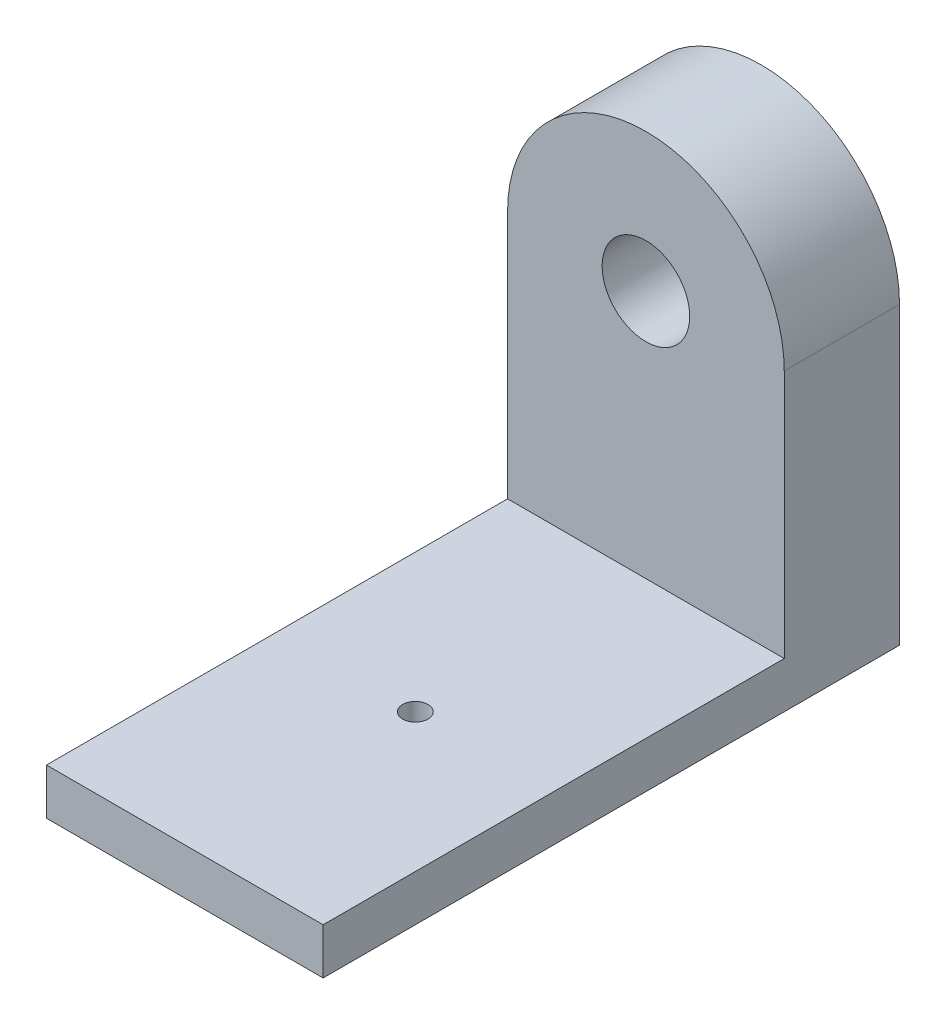
ISO-10303-21;
HEADER;
FILE_DESCRIPTION(('STEP AP214'),'2;1');
FILE_NAME('part.step','',(''),(''),'','','');
FILE_SCHEMA(('AUTOMOTIVE_DESIGN { 1 0 10303 214 1 1 1 1 }'));
ENDSEC;
DATA;
#1=APPLICATION_CONTEXT('core data for automotive mechanical design processes');
#2=APPLICATION_PROTOCOL_DEFINITION('international standard','automotive_design',2000,#1);
#3=PRODUCT_CONTEXT('',#1,'mechanical');
#4=PRODUCT('Part','Part','',(#3));
#5=PRODUCT_RELATED_PRODUCT_CATEGORY('part','',(#4));
#6=PRODUCT_DEFINITION_FORMATION('','',#4);
#7=PRODUCT_DEFINITION_CONTEXT('part definition',#1,'design');
#8=PRODUCT_DEFINITION('design','',#6,#7);
#9=PRODUCT_DEFINITION_SHAPE('','',#8);
#10=(LENGTH_UNIT() NAMED_UNIT(*) SI_UNIT(.MILLI.,.METRE.));
#11=(NAMED_UNIT(*) PLANE_ANGLE_UNIT() SI_UNIT($,.RADIAN.));
#12=(NAMED_UNIT(*) SI_UNIT($,.STERADIAN.) SOLID_ANGLE_UNIT());
#13=UNCERTAINTY_MEASURE_WITH_UNIT(LENGTH_MEASURE(1.E-05),#10,'distance_accuracy_value','');
#14=(GEOMETRIC_REPRESENTATION_CONTEXT(3) GLOBAL_UNCERTAINTY_ASSIGNED_CONTEXT((#13)) GLOBAL_UNIT_ASSIGNED_CONTEXT((#10,
#11,#12)) REPRESENTATION_CONTEXT('',''));
#15=CARTESIAN_POINT('',(0.,0.,0.));
#16=DIRECTION('',(0.,0.,1.));
#17=DIRECTION('',(1.,0.,0.));
#18=AXIS2_PLACEMENT_3D('',#15,#16,#17);
#19=CARTESIAN_POINT('',(0.,10.,0.));
#20=DIRECTION('',(1.,0.,0.));
#21=DIRECTION('',(0.,0.,-1.));
#22=AXIS2_PLACEMENT_3D('',#19,#20,#21);
#23=PLANE('',#22);
#24=DIRECTION('',(0.,0.,1.));
#25=VECTOR('',#24,1.);
#26=CARTESIAN_POINT('',(0.,0.,0.));
#27=LINE('',#26,#25);
#28=CARTESIAN_POINT('',(0.,0.,-125.));
#29=VERTEX_POINT('',#28);
#30=CARTESIAN_POINT('',(0.,0.,0.));
#31=VERTEX_POINT('',#30);
#32=EDGE_CURVE('E99',#29,#31,#27,.T.);
#33=ORIENTED_EDGE('',*,*,#32,.T.);
#34=DIRECTION('',(0.,-1.,0.));
#35=VECTOR('',#34,1.);
#36=CARTESIAN_POINT('',(0.,10.,0.));
#37=LINE('',#36,#35);
#38=CARTESIAN_POINT('',(0.,10.,0.));
#39=VERTEX_POINT('',#38);
#40=EDGE_CURVE('E11',#39,#31,#37,.T.);
#41=ORIENTED_EDGE('',*,*,#40,.F.);
#42=DIRECTION('',(0.,0.,1.));
#43=VECTOR('',#42,1.);
#44=CARTESIAN_POINT('',(0.,10.,0.));
#45=LINE('',#44,#43);
#46=CARTESIAN_POINT('',(0.,10.,-100.));
#47=VERTEX_POINT('',#46);
#48=EDGE_CURVE('E93',#47,#39,#45,.T.);
#49=ORIENTED_EDGE('',*,*,#48,.F.);
#50=DIRECTION('',(0.,1.,0.));
#51=VECTOR('',#50,1.);
#52=CARTESIAN_POINT('',(0.,10.,-100.));
#53=LINE('',#52,#51);
#54=CARTESIAN_POINT('',(0.,64.,-100.));
#55=VERTEX_POINT('',#54);
#56=EDGE_CURVE('E51',#47,#55,#53,.T.);
#57=ORIENTED_EDGE('',*,*,#56,.T.);
#58=DIRECTION('',(0.,0.,-1.));
#59=VECTOR('',#58,1.);
#60=CARTESIAN_POINT('',(0.,64.,-100.));
#61=LINE('',#60,#59);
#62=CARTESIAN_POINT('',(0.,64.,-125.));
#63=VERTEX_POINT('',#62);
#64=EDGE_CURVE('E101',#55,#63,#61,.T.);
#65=ORIENTED_EDGE('',*,*,#64,.T.);
#66=DIRECTION('',(0.,-1.,0.));
#67=VECTOR('',#66,1.);
#68=CARTESIAN_POINT('',(0.,10.,-125.));
#69=LINE('',#68,#67);
#70=EDGE_CURVE('E86',#63,#29,#69,.T.);
#71=ORIENTED_EDGE('',*,*,#70,.T.);
#72=EDGE_LOOP('',(#33,#41,#49,#57,#65,#71));
#73=FACE_BOUND('',#72,.T.);
#74=ADVANCED_FACE('F35',(#73),#23,.F.);
#75=CARTESIAN_POINT('',(0.,10.,0.));
#76=DIRECTION('',(0.,0.,-1.));
#77=DIRECTION('',(-1.,0.,0.));
#78=AXIS2_PLACEMENT_3D('',#75,#76,#77);
#79=PLANE('',#78);
#80=DIRECTION('',(1.,0.,0.));
#81=VECTOR('',#80,1.);
#82=CARTESIAN_POINT('',(0.,0.,0.));
#83=LINE('',#82,#81);
#84=CARTESIAN_POINT('',(60.,0.,0.));
#85=VERTEX_POINT('',#84);
#86=EDGE_CURVE('E106',#31,#85,#83,.T.);
#87=ORIENTED_EDGE('',*,*,#86,.T.);
#88=DIRECTION('',(0.,-1.,0.));
#89=VECTOR('',#88,1.);
#90=CARTESIAN_POINT('',(60.,10.,0.));
#91=LINE('',#90,#89);
#92=CARTESIAN_POINT('',(60.,10.,0.));
#93=VERTEX_POINT('',#92);
#94=EDGE_CURVE('E43',#93,#85,#91,.T.);
#95=ORIENTED_EDGE('',*,*,#94,.F.);
#96=DIRECTION('',(1.,0.,0.));
#97=VECTOR('',#96,1.);
#98=CARTESIAN_POINT('',(0.,10.,0.));
#99=LINE('',#98,#97);
#100=EDGE_CURVE('E60',#39,#93,#99,.T.);
#101=ORIENTED_EDGE('',*,*,#100,.F.);
#102=ORIENTED_EDGE('',*,*,#40,.T.);
#103=EDGE_LOOP('',(#87,#95,#101,#102));
#104=FACE_BOUND('',#103,.T.);
#105=ADVANCED_FACE('F173',(#104),#79,.F.);
#106=CARTESIAN_POINT('',(60.,10.,0.));
#107=DIRECTION('',(-1.,0.,0.));
#108=DIRECTION('',(0.,0.,1.));
#109=AXIS2_PLACEMENT_3D('',#106,#107,#108);
#110=PLANE('',#109);
#111=DIRECTION('',(0.,0.,-1.));
#112=VECTOR('',#111,1.);
#113=CARTESIAN_POINT('',(60.,0.,0.));
#114=LINE('',#113,#112);
#115=CARTESIAN_POINT('',(60.,0.,-125.));
#116=VERTEX_POINT('',#115);
#117=EDGE_CURVE('E94',#85,#116,#114,.T.);
#118=ORIENTED_EDGE('',*,*,#117,.T.);
#119=DIRECTION('',(0.,-1.,0.));
#120=VECTOR('',#119,1.);
#121=CARTESIAN_POINT('',(60.,10.,-125.));
#122=LINE('',#121,#120);
#123=CARTESIAN_POINT('',(60.,64.,-125.));
#124=VERTEX_POINT('',#123);
#125=EDGE_CURVE('E89',#124,#116,#122,.T.);
#126=ORIENTED_EDGE('',*,*,#125,.F.);
#127=DIRECTION('',(0.,0.,-1.));
#128=VECTOR('',#127,1.);
#129=CARTESIAN_POINT('',(60.,64.,-100.));
#130=LINE('',#129,#128);
#131=CARTESIAN_POINT('',(60.,64.,-100.));
#132=VERTEX_POINT('',#131);
#133=EDGE_CURVE('E107',#132,#124,#130,.T.);
#134=ORIENTED_EDGE('',*,*,#133,.F.);
#135=DIRECTION('',(0.,-1.,0.));
#136=VECTOR('',#135,1.);
#137=CARTESIAN_POINT('',(60.,10.,-100.));
#138=LINE('',#137,#136);
#139=CARTESIAN_POINT('',(60.,10.,-100.));
#140=VERTEX_POINT('',#139);
#141=EDGE_CURVE('E138',#132,#140,#138,.T.);
#142=ORIENTED_EDGE('',*,*,#141,.T.);
#143=DIRECTION('',(0.,0.,-1.));
#144=VECTOR('',#143,1.);
#145=CARTESIAN_POINT('',(60.,10.,0.));
#146=LINE('',#145,#144);
#147=EDGE_CURVE('E103',#93,#140,#146,.T.);
#148=ORIENTED_EDGE('',*,*,#147,.F.);
#149=ORIENTED_EDGE('',*,*,#94,.T.);
#150=EDGE_LOOP('',(#118,#126,#134,#142,#148,#149));
#151=FACE_BOUND('',#150,.T.);
#152=ADVANCED_FACE('F135',(#151),#110,.F.);
#153=CARTESIAN_POINT('',(0.,10.,-125.));
#154=DIRECTION('',(0.,0.,1.));
#155=DIRECTION('',(1.,0.,0.));
#156=AXIS2_PLACEMENT_3D('',#153,#154,#155);
#157=PLANE('',#156);
#158=DIRECTION('',(-1.,0.,0.));
#159=VECTOR('',#158,1.);
#160=CARTESIAN_POINT('',(0.,0.,-125.));
#161=LINE('',#160,#159);
#162=EDGE_CURVE('E80',#116,#29,#161,.T.);
#163=ORIENTED_EDGE('',*,*,#162,.T.);
#164=ORIENTED_EDGE('',*,*,#70,.F.);
#165=CARTESIAN_POINT('',(30.,64.,-125.));
#166=DIRECTION('',(0.,0.,-1.));
#167=DIRECTION('',(-1.,0.,0.));
#168=AXIS2_PLACEMENT_3D('',#165,#166,#167);
#169=CIRCLE('',#168,30.);
#170=EDGE_CURVE('E140',#63,#124,#169,.T.);
#171=ORIENTED_EDGE('',*,*,#170,.T.);
#172=ORIENTED_EDGE('',*,*,#125,.T.);
#173=EDGE_LOOP('',(#163,#164,#171,#172));
#174=FACE_BOUND('',#173,.T.);
#175=CARTESIAN_POINT('',(30.,64.,-125.));
#176=DIRECTION('',(0.,0.,-1.));
#177=DIRECTION('',(-1.,0.,0.));
#178=AXIS2_PLACEMENT_3D('',#175,#176,#177);
#179=CIRCLE('',#178,9.5);
#180=CARTESIAN_POINT('',(20.5,64.,-125.));
#181=VERTEX_POINT('',#180);
#182=EDGE_CURVE('E151',#181,#181,#179,.T.);
#183=ORIENTED_EDGE('',*,*,#182,.F.);
#184=EDGE_LOOP('',(#183));
#185=FACE_BOUND('',#184,.T.);
#186=ADVANCED_FACE('F82',(#174,#185),#157,.F.);
#187=CARTESIAN_POINT('',(0.,10.,-125.));
#188=DIRECTION('',(0.,-1.,0.));
#189=DIRECTION('',(0.,0.,-1.));
#190=AXIS2_PLACEMENT_3D('',#187,#188,#189);
#191=PLANE('',#190);
#192=CARTESIAN_POINT('',(30.,10.,-50.));
#193=DIRECTION('',(0.,1.,0.));
#194=DIRECTION('',(0.,0.,1.));
#195=AXIS2_PLACEMENT_3D('',#192,#193,#194);
#196=CIRCLE('',#195,2.75);
#197=CARTESIAN_POINT('',(30.,10.,-47.25));
#198=VERTEX_POINT('',#197);
#199=EDGE_CURVE('E194',#198,#198,#196,.T.);
#200=ORIENTED_EDGE('',*,*,#199,.F.);
#201=EDGE_LOOP('',(#200));
#202=FACE_BOUND('',#201,.T.);
#203=ORIENTED_EDGE('',*,*,#147,.T.);
#204=DIRECTION('',(-1.,0.,0.));
#205=VECTOR('',#204,1.);
#206=CARTESIAN_POINT('',(60.,10.,-100.));
#207=LINE('',#206,#205);
#208=EDGE_CURVE('E128',#140,#47,#207,.T.);
#209=ORIENTED_EDGE('',*,*,#208,.T.);
#210=ORIENTED_EDGE('',*,*,#48,.T.);
#211=ORIENTED_EDGE('',*,*,#100,.T.);
#212=EDGE_LOOP('',(#203,#209,#210,#211));
#213=FACE_BOUND('',#212,.T.);
#214=ADVANCED_FACE('F127',(#202,#213),#191,.F.);
#215=CARTESIAN_POINT('',(0.,0.,-125.));
#216=DIRECTION('',(0.,-1.,0.));
#217=DIRECTION('',(0.,0.,-1.));
#218=AXIS2_PLACEMENT_3D('',#215,#216,#217);
#219=PLANE('',#218);
#220=CARTESIAN_POINT('',(30.,0.,-50.));
#221=DIRECTION('',(0.,-1.,0.));
#222=DIRECTION('',(0.,0.,-1.));
#223=AXIS2_PLACEMENT_3D('',#220,#221,#222);
#224=CIRCLE('',#223,2.75);
#225=CARTESIAN_POINT('',(30.,0.,-52.75));
#226=VERTEX_POINT('',#225);
#227=EDGE_CURVE('E196',#226,#226,#224,.F.);
#228=ORIENTED_EDGE('',*,*,#227,.T.);
#229=EDGE_LOOP('',(#228));
#230=FACE_BOUND('',#229,.T.);
#231=ORIENTED_EDGE('',*,*,#32,.F.);
#232=ORIENTED_EDGE('',*,*,#162,.F.);
#233=ORIENTED_EDGE('',*,*,#117,.F.);
#234=ORIENTED_EDGE('',*,*,#86,.F.);
#235=EDGE_LOOP('',(#231,#232,#233,#234));
#236=FACE_BOUND('',#235,.T.);
#237=ADVANCED_FACE('F105',(#230,#236),#219,.T.);
#238=CARTESIAN_POINT('',(30.,64.,-100.));
#239=DIRECTION('',(0.,0.,-1.));
#240=DIRECTION('',(-1.,0.,0.));
#241=AXIS2_PLACEMENT_3D('',#238,#239,#240);
#242=CYLINDRICAL_SURFACE('',#241,30.);
#243=ORIENTED_EDGE('',*,*,#170,.F.);
#244=ORIENTED_EDGE('',*,*,#64,.F.);
#245=CARTESIAN_POINT('',(30.,64.,-100.));
#246=DIRECTION('',(0.,0.,-1.));
#247=DIRECTION('',(-1.,0.,0.));
#248=AXIS2_PLACEMENT_3D('',#245,#246,#247);
#249=CIRCLE('',#248,30.);
#250=EDGE_CURVE('E146',#55,#132,#249,.T.);
#251=ORIENTED_EDGE('',*,*,#250,.T.);
#252=ORIENTED_EDGE('',*,*,#133,.T.);
#253=EDGE_LOOP('',(#243,#244,#251,#252));
#254=FACE_BOUND('',#253,.T.);
#255=ADVANCED_FACE('F154',(#254),#242,.T.);
#256=CARTESIAN_POINT('',(30.,64.,-100.));
#257=DIRECTION('',(0.,0.,-1.));
#258=DIRECTION('',(-1.,0.,0.));
#259=AXIS2_PLACEMENT_3D('',#256,#257,#258);
#260=PLANE('',#259);
#261=CARTESIAN_POINT('',(30.,64.,-100.));
#262=DIRECTION('',(0.,0.,-1.));
#263=DIRECTION('',(-1.,0.,0.));
#264=AXIS2_PLACEMENT_3D('',#261,#262,#263);
#265=CIRCLE('',#264,9.5);
#266=CARTESIAN_POINT('',(20.5,64.,-100.));
#267=VERTEX_POINT('',#266);
#268=EDGE_CURVE('E141',#267,#267,#265,.T.);
#269=ORIENTED_EDGE('',*,*,#268,.T.);
#270=EDGE_LOOP('',(#269));
#271=FACE_BOUND('',#270,.T.);
#272=ORIENTED_EDGE('',*,*,#141,.F.);
#273=ORIENTED_EDGE('',*,*,#250,.F.);
#274=ORIENTED_EDGE('',*,*,#56,.F.);
#275=ORIENTED_EDGE('',*,*,#208,.F.);
#276=EDGE_LOOP('',(#272,#273,#274,#275));
#277=FACE_BOUND('',#276,.T.);
#278=ADVANCED_FACE('F156',(#271,#277),#260,.F.);
#279=CARTESIAN_POINT('',(30.,64.,-100.));
#280=DIRECTION('',(0.,0.,-1.));
#281=DIRECTION('',(-1.,0.,0.));
#282=AXIS2_PLACEMENT_3D('',#279,#280,#281);
#283=CYLINDRICAL_SURFACE('',#282,9.5);
#284=ORIENTED_EDGE('',*,*,#268,.F.);
#285=EDGE_LOOP('',(#284));
#286=FACE_BOUND('',#285,.T.);
#287=ORIENTED_EDGE('',*,*,#182,.T.);
#288=EDGE_LOOP('',(#287));
#289=FACE_BOUND('',#288,.T.);
#290=ADVANCED_FACE('F160',(#286,#289),#283,.F.);
#291=CARTESIAN_POINT('',(30.,-0.000999999999999265,-50.));
#292=DIRECTION('',(0.,1.,0.));
#293=DIRECTION('',(0.,0.,1.));
#294=AXIS2_PLACEMENT_3D('',#291,#292,#293);
#295=CYLINDRICAL_SURFACE('',#294,2.75);
#296=ORIENTED_EDGE('',*,*,#227,.F.);
#297=EDGE_LOOP('',(#296));
#298=FACE_BOUND('',#297,.T.);
#299=ORIENTED_EDGE('',*,*,#199,.T.);
#300=EDGE_LOOP('',(#299));
#301=FACE_BOUND('',#300,.T.);
#302=ADVANCED_FACE('F167',(#298,#301),#295,.F.);
#303=CLOSED_SHELL('',(#74,#105,#152,#186,#214,#237,#255,#278,#290,#302));
#304=MANIFOLD_SOLID_BREP('B2',#303);
#305=ADVANCED_BREP_SHAPE_REPRESENTATION('',(#18,#304),#14);
#306=SHAPE_DEFINITION_REPRESENTATION(#9,#305);
ENDSEC;
END-ISO-10303-21;
